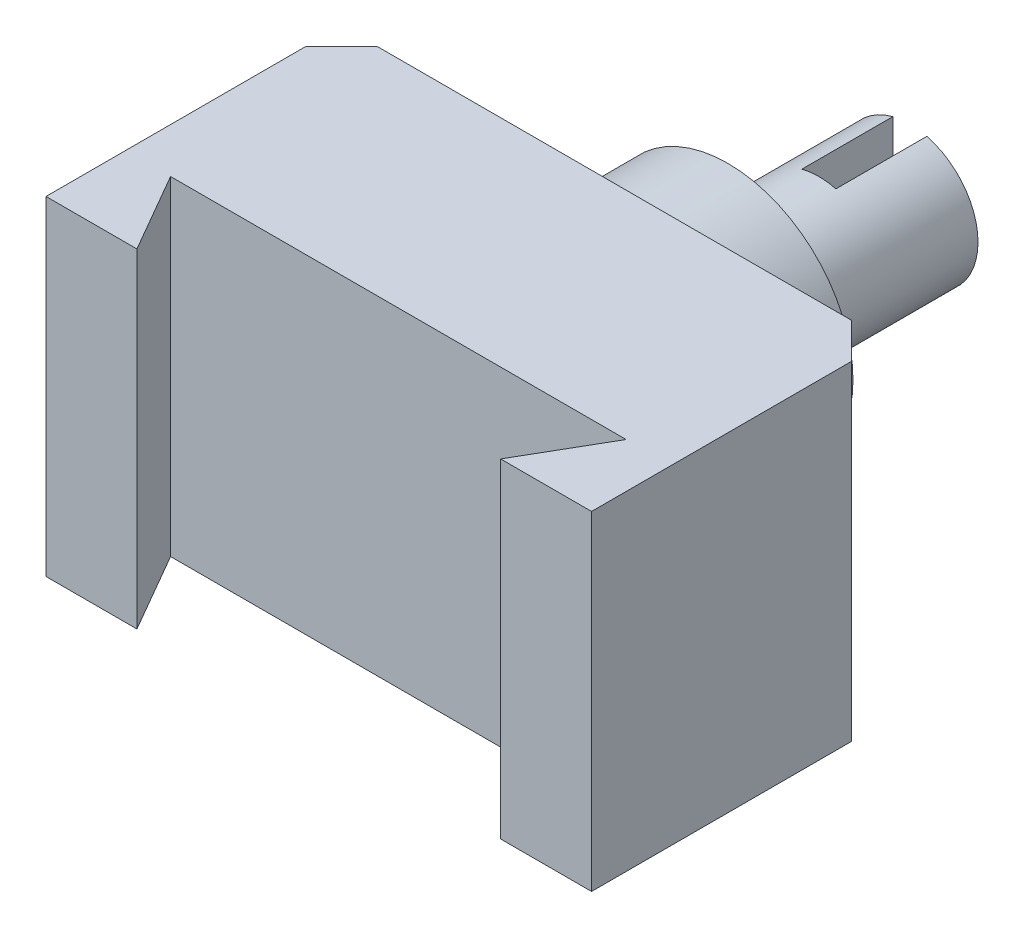
ISO-10303-21;
HEADER;
FILE_DESCRIPTION(('STEP AP214'),'2;1');
FILE_NAME('part.step','',(''),(''),'','','');
FILE_SCHEMA(('AUTOMOTIVE_DESIGN { 1 0 10303 214 1 1 1 1 }'));
ENDSEC;
DATA;
#1=APPLICATION_CONTEXT('core data for automotive mechanical design processes');
#2=APPLICATION_PROTOCOL_DEFINITION('international standard','automotive_design',2000,#1);
#3=PRODUCT_CONTEXT('',#1,'mechanical');
#4=PRODUCT('Part','Part','',(#3));
#5=PRODUCT_RELATED_PRODUCT_CATEGORY('part','',(#4));
#6=PRODUCT_DEFINITION_FORMATION('','',#4);
#7=PRODUCT_DEFINITION_CONTEXT('part definition',#1,'design');
#8=PRODUCT_DEFINITION('design','',#6,#7);
#9=PRODUCT_DEFINITION_SHAPE('','',#8);
#10=(LENGTH_UNIT() NAMED_UNIT(*) SI_UNIT(.MILLI.,.METRE.));
#11=(NAMED_UNIT(*) PLANE_ANGLE_UNIT() SI_UNIT($,.RADIAN.));
#12=(NAMED_UNIT(*) SI_UNIT($,.STERADIAN.) SOLID_ANGLE_UNIT());
#13=UNCERTAINTY_MEASURE_WITH_UNIT(LENGTH_MEASURE(1.E-05),#10,'distance_accuracy_value','');
#14=(GEOMETRIC_REPRESENTATION_CONTEXT(3) GLOBAL_UNCERTAINTY_ASSIGNED_CONTEXT((#13)) GLOBAL_UNIT_ASSIGNED_CONTEXT((#10,
#11,#12)) REPRESENTATION_CONTEXT('',''));
#15=CARTESIAN_POINT('',(0.,0.,0.));
#16=DIRECTION('',(0.,0.,1.));
#17=DIRECTION('',(1.,0.,0.));
#18=AXIS2_PLACEMENT_3D('',#15,#16,#17);
#19=CARTESIAN_POINT('',(0.,0.,-123.825));
#20=DIRECTION('',(0.,0.,-1.));
#21=DIRECTION('',(-1.,0.,0.));
#22=AXIS2_PLACEMENT_3D('',#19,#20,#21);
#23=PLANE('',#22);
#24=DIRECTION('',(0.,1.,0.));
#25=VECTOR('',#24,1.);
#26=CARTESIAN_POINT('',(-4.76250000000001,18.4450831863128,-123.825));
#27=LINE('',#26,#25);
#28=CARTESIAN_POINT('',(-4.7625,-18.4450831863128,-123.825));
#29=VERTEX_POINT('',#28);
#30=CARTESIAN_POINT('',(-4.76250000000001,18.4450831863128,-123.825));
#31=VERTEX_POINT('',#30);
#32=EDGE_CURVE('E171',#29,#31,#27,.T.);
#33=ORIENTED_EDGE('',*,*,#32,.F.);
#34=CARTESIAN_POINT('',(0.,0.,-123.825));
#35=DIRECTION('',(0.,0.,-1.));
#36=DIRECTION('',(-1.,0.,0.));
#37=AXIS2_PLACEMENT_3D('',#34,#35,#36);
#38=CIRCLE('',#37,19.05);
#39=EDGE_CURVE('E187',#29,#31,#38,.T.);
#40=ORIENTED_EDGE('',*,*,#39,.T.);
#41=EDGE_LOOP('',(#33,#40));
#42=FACE_BOUND('',#41,.T.);
#43=ADVANCED_FACE('F45',(#42),#23,.T.);
#44=CARTESIAN_POINT('',(76.2,45.974,41.275));
#45=DIRECTION('',(-1.,0.,0.));
#46=DIRECTION('',(0.,0.,1.));
#47=AXIS2_PLACEMENT_3D('',#44,#45,#46);
#48=PLANE('',#47);
#49=DIRECTION('',(0.,0.,-1.));
#50=VECTOR('',#49,1.);
#51=CARTESIAN_POINT('',(76.2,-45.974,41.275));
#52=LINE('',#51,#50);
#53=CARTESIAN_POINT('',(76.2,-45.974,41.275));
#54=VERTEX_POINT('',#53);
#55=CARTESIAN_POINT('',(76.2,-45.974,-31.2749999999999));
#56=VERTEX_POINT('',#55);
#57=EDGE_CURVE('E202',#54,#56,#52,.T.);
#58=ORIENTED_EDGE('',*,*,#57,.T.);
#59=DIRECTION('',(0.,1.,0.));
#60=VECTOR('',#59,1.);
#61=CARTESIAN_POINT('',(76.2,45.974,-31.2749999999999));
#62=LINE('',#61,#60);
#63=CARTESIAN_POINT('',(76.2,45.974,-31.2749999999999));
#64=VERTEX_POINT('',#63);
#65=EDGE_CURVE('E11',#56,#64,#62,.T.);
#66=ORIENTED_EDGE('',*,*,#65,.T.);
#67=DIRECTION('',(0.,0.,-1.));
#68=VECTOR('',#67,1.);
#69=CARTESIAN_POINT('',(76.2,45.974,41.275));
#70=LINE('',#69,#68);
#71=CARTESIAN_POINT('',(76.2,45.974,41.275));
#72=VERTEX_POINT('',#71);
#73=EDGE_CURVE('E207',#72,#64,#70,.T.);
#74=ORIENTED_EDGE('',*,*,#73,.F.);
#75=DIRECTION('',(0.,-1.,0.));
#76=VECTOR('',#75,1.);
#77=CARTESIAN_POINT('',(76.2,45.974,41.275));
#78=LINE('',#77,#76);
#79=EDGE_CURVE('E232',#72,#54,#78,.T.);
#80=ORIENTED_EDGE('',*,*,#79,.T.);
#81=EDGE_LOOP('',(#58,#66,#74,#80));
#82=FACE_BOUND('',#81,.T.);
#83=ADVANCED_FACE('F317',(#82),#48,.F.);
#84=CARTESIAN_POINT('',(-76.2,45.974,-41.275));
#85=DIRECTION('',(0.,0.,1.));
#86=DIRECTION('',(1.,0.,0.));
#87=AXIS2_PLACEMENT_3D('',#84,#85,#86);
#88=PLANE('',#87);
#89=CARTESIAN_POINT('',(0.,0.,-41.275));
#90=DIRECTION('',(0.,0.,-1.));
#91=DIRECTION('',(-1.,0.,0.));
#92=AXIS2_PLACEMENT_3D('',#89,#90,#91);
#93=CIRCLE('',#92,34.925);
#94=CARTESIAN_POINT('',(-34.925,0.,-41.275));
#95=VERTEX_POINT('',#94);
#96=EDGE_CURVE('E197',#95,#95,#93,.T.);
#97=ORIENTED_EDGE('',*,*,#96,.F.);
#98=EDGE_LOOP('',(#97));
#99=FACE_BOUND('',#98,.T.);
#100=DIRECTION('',(-1.,0.,0.));
#101=VECTOR('',#100,1.);
#102=CARTESIAN_POINT('',(-76.2,-45.974,-41.275));
#103=LINE('',#102,#101);
#104=CARTESIAN_POINT('',(66.1999999999999,-45.974,-41.275));
#105=VERTEX_POINT('',#104);
#106=CARTESIAN_POINT('',(-66.2,-45.974,-41.275));
#107=VERTEX_POINT('',#106);
#108=EDGE_CURVE('E235',#105,#107,#103,.T.);
#109=ORIENTED_EDGE('',*,*,#108,.T.);
#110=DIRECTION('',(0.,1.,0.));
#111=VECTOR('',#110,1.);
#112=CARTESIAN_POINT('',(-66.2,45.974,-41.275));
#113=LINE('',#112,#111);
#114=CARTESIAN_POINT('',(-66.2,45.974,-41.275));
#115=VERTEX_POINT('',#114);
#116=EDGE_CURVE('E68',#107,#115,#113,.T.);
#117=ORIENTED_EDGE('',*,*,#116,.T.);
#118=DIRECTION('',(-1.,0.,0.));
#119=VECTOR('',#118,1.);
#120=CARTESIAN_POINT('',(-76.2,45.974,-41.275));
#121=LINE('',#120,#119);
#122=CARTESIAN_POINT('',(66.1999999999999,45.974,-41.275));
#123=VERTEX_POINT('',#122);
#124=EDGE_CURVE('E210',#123,#115,#121,.T.);
#125=ORIENTED_EDGE('',*,*,#124,.F.);
#126=DIRECTION('',(0.,-1.,0.));
#127=VECTOR('',#126,1.);
#128=CARTESIAN_POINT('',(66.2,45.974,-41.275));
#129=LINE('',#128,#127);
#130=EDGE_CURVE('E286',#123,#105,#129,.T.);
#131=ORIENTED_EDGE('',*,*,#130,.T.);
#132=EDGE_LOOP('',(#109,#117,#125,#131));
#133=FACE_BOUND('',#132,.T.);
#134=ADVANCED_FACE('F311',(#99,#133),#88,.F.);
#135=CARTESIAN_POINT('',(-76.2,45.974,41.275));
#136=DIRECTION('',(1.,0.,0.));
#137=DIRECTION('',(0.,0.,-1.));
#138=AXIS2_PLACEMENT_3D('',#135,#136,#137);
#139=PLANE('',#138);
#140=DIRECTION('',(0.,0.,1.));
#141=VECTOR('',#140,1.);
#142=CARTESIAN_POINT('',(-76.2,45.974,41.275));
#143=LINE('',#142,#141);
#144=CARTESIAN_POINT('',(-76.2,45.974,-31.275));
#145=VERTEX_POINT('',#144);
#146=CARTESIAN_POINT('',(-76.2,45.974,41.275));
#147=VERTEX_POINT('',#146);
#148=EDGE_CURVE('E214',#145,#147,#143,.T.);
#149=ORIENTED_EDGE('',*,*,#148,.F.);
#150=DIRECTION('',(0.,-1.,0.));
#151=VECTOR('',#150,1.);
#152=CARTESIAN_POINT('',(-76.2,45.974,-31.275));
#153=LINE('',#152,#151);
#154=CARTESIAN_POINT('',(-76.2,-45.974,-31.275));
#155=VERTEX_POINT('',#154);
#156=EDGE_CURVE('E196',#145,#155,#153,.T.);
#157=ORIENTED_EDGE('',*,*,#156,.T.);
#158=DIRECTION('',(0.,0.,1.));
#159=VECTOR('',#158,1.);
#160=CARTESIAN_POINT('',(-76.2,-45.974,41.275));
#161=LINE('',#160,#159);
#162=CARTESIAN_POINT('',(-76.2,-45.974,41.275));
#163=VERTEX_POINT('',#162);
#164=EDGE_CURVE('E238',#155,#163,#161,.T.);
#165=ORIENTED_EDGE('',*,*,#164,.T.);
#166=DIRECTION('',(0.,-1.,0.));
#167=VECTOR('',#166,1.);
#168=CARTESIAN_POINT('',(-76.2,45.974,41.275));
#169=LINE('',#168,#167);
#170=EDGE_CURVE('E206',#147,#163,#169,.T.);
#171=ORIENTED_EDGE('',*,*,#170,.F.);
#172=EDGE_LOOP('',(#149,#157,#165,#171));
#173=FACE_BOUND('',#172,.T.);
#174=ADVANCED_FACE('F303',(#173),#139,.F.);
#175=CARTESIAN_POINT('',(-76.2,45.974,41.275));
#176=DIRECTION('',(0.,0.,-1.));
#177=DIRECTION('',(-1.,0.,0.));
#178=AXIS2_PLACEMENT_3D('',#175,#176,#177);
#179=PLANE('',#178);
#180=DIRECTION('',(1.,0.,0.));
#181=VECTOR('',#180,1.);
#182=CARTESIAN_POINT('',(-76.2,-45.974,41.275));
#183=LINE('',#182,#181);
#184=CARTESIAN_POINT('',(-50.8,-45.974,41.275));
#185=VERTEX_POINT('',#184);
#186=EDGE_CURVE('E241',#163,#185,#183,.T.);
#187=ORIENTED_EDGE('',*,*,#186,.T.);
#188=DIRECTION('',(0.,-1.,0.));
#189=VECTOR('',#188,1.);
#190=CARTESIAN_POINT('',(-50.8,45.974,41.275));
#191=LINE('',#190,#189);
#192=CARTESIAN_POINT('',(-50.8,45.974,41.275));
#193=VERTEX_POINT('',#192);
#194=EDGE_CURVE('E270',#193,#185,#191,.T.);
#195=ORIENTED_EDGE('',*,*,#194,.F.);
#196=DIRECTION('',(1.,0.,0.));
#197=VECTOR('',#196,1.);
#198=CARTESIAN_POINT('',(-76.2,45.974,41.275));
#199=LINE('',#198,#197);
#200=EDGE_CURVE('E217',#147,#193,#199,.T.);
#201=ORIENTED_EDGE('',*,*,#200,.F.);
#202=ORIENTED_EDGE('',*,*,#170,.T.);
#203=EDGE_LOOP('',(#187,#195,#201,#202));
#204=FACE_BOUND('',#203,.T.);
#205=ADVANCED_FACE('F339',(#204),#179,.F.);
#206=CARTESIAN_POINT('',(-50.8,45.974,41.275));
#207=DIRECTION('',(-0.866025403784437,0.,0.500000000000003));
#208=DIRECTION('',(0.500000000000004,0.,0.866025403784437));
#209=AXIS2_PLACEMENT_3D('',#206,#207,#208);
#210=PLANE('',#209);
#211=DIRECTION('',(-0.500000000000003,0.,-0.866025403784437));
#212=VECTOR('',#211,1.);
#213=CARTESIAN_POINT('',(-50.8,-45.974,41.275));
#214=LINE('',#213,#212);
#215=CARTESIAN_POINT('',(-63.6316097327395,-45.974,19.05));
#216=VERTEX_POINT('',#215);
#217=EDGE_CURVE('E244',#185,#216,#214,.T.);
#218=ORIENTED_EDGE('',*,*,#217,.T.);
#219=DIRECTION('',(0.,-1.,0.));
#220=VECTOR('',#219,1.);
#221=CARTESIAN_POINT('',(-63.6316097327395,45.974,19.05));
#222=LINE('',#221,#220);
#223=CARTESIAN_POINT('',(-63.6316097327395,45.974,19.05));
#224=VERTEX_POINT('',#223);
#225=EDGE_CURVE('E266',#224,#216,#222,.T.);
#226=ORIENTED_EDGE('',*,*,#225,.F.);
#227=DIRECTION('',(-0.500000000000003,0.,-0.866025403784437));
#228=VECTOR('',#227,1.);
#229=CARTESIAN_POINT('',(-50.8,45.974,41.275));
#230=LINE('',#229,#228);
#231=EDGE_CURVE('E220',#193,#224,#230,.T.);
#232=ORIENTED_EDGE('',*,*,#231,.F.);
#233=ORIENTED_EDGE('',*,*,#194,.T.);
#234=EDGE_LOOP('',(#218,#226,#232,#233));
#235=FACE_BOUND('',#234,.T.);
#236=ADVANCED_FACE('F336',(#235),#210,.F.);
#237=CARTESIAN_POINT('',(-63.6316097327395,45.974,19.05));
#238=DIRECTION('',(0.,0.,-1.));
#239=DIRECTION('',(-1.,0.,0.));
#240=AXIS2_PLACEMENT_3D('',#237,#238,#239);
#241=PLANE('',#240);
#242=DIRECTION('',(1.,0.,0.));
#243=VECTOR('',#242,1.);
#244=CARTESIAN_POINT('',(-63.6316097327395,-45.974,19.05));
#245=LINE('',#244,#243);
#246=CARTESIAN_POINT('',(63.6316097327396,-45.974,19.05));
#247=VERTEX_POINT('',#246);
#248=EDGE_CURVE('E247',#216,#247,#245,.T.);
#249=ORIENTED_EDGE('',*,*,#248,.T.);
#250=DIRECTION('',(0.,-1.,0.));
#251=VECTOR('',#250,1.);
#252=CARTESIAN_POINT('',(63.6316097327396,45.974,19.05));
#253=LINE('',#252,#251);
#254=CARTESIAN_POINT('',(63.6316097327396,45.974,19.05));
#255=VERTEX_POINT('',#254);
#256=EDGE_CURVE('E262',#255,#247,#253,.T.);
#257=ORIENTED_EDGE('',*,*,#256,.F.);
#258=DIRECTION('',(1.,0.,0.));
#259=VECTOR('',#258,1.);
#260=CARTESIAN_POINT('',(-63.6316097327395,45.974,19.05));
#261=LINE('',#260,#259);
#262=EDGE_CURVE('E223',#224,#255,#261,.T.);
#263=ORIENTED_EDGE('',*,*,#262,.F.);
#264=ORIENTED_EDGE('',*,*,#225,.T.);
#265=EDGE_LOOP('',(#249,#257,#263,#264));
#266=FACE_BOUND('',#265,.T.);
#267=ADVANCED_FACE('F332',(#266),#241,.F.);
#268=CARTESIAN_POINT('',(63.6316097327396,45.974,19.05));
#269=DIRECTION('',(0.866025403784436,0.,0.500000000000004));
#270=DIRECTION('',(0.500000000000004,0.,-0.866025403784437));
#271=AXIS2_PLACEMENT_3D('',#268,#269,#270);
#272=PLANE('',#271);
#273=DIRECTION('',(-0.500000000000004,0.,0.866025403784436));
#274=VECTOR('',#273,1.);
#275=CARTESIAN_POINT('',(63.6316097327396,-45.974,19.05));
#276=LINE('',#275,#274);
#277=CARTESIAN_POINT('',(50.8,-45.974,41.275));
#278=VERTEX_POINT('',#277);
#279=EDGE_CURVE('E250',#247,#278,#276,.T.);
#280=ORIENTED_EDGE('',*,*,#279,.T.);
#281=DIRECTION('',(0.,-1.,0.));
#282=VECTOR('',#281,1.);
#283=CARTESIAN_POINT('',(50.8,45.974,41.275));
#284=LINE('',#283,#282);
#285=CARTESIAN_POINT('',(50.8,45.974,41.275));
#286=VERTEX_POINT('',#285);
#287=EDGE_CURVE('E258',#286,#278,#284,.T.);
#288=ORIENTED_EDGE('',*,*,#287,.F.);
#289=DIRECTION('',(-0.500000000000004,0.,0.866025403784436));
#290=VECTOR('',#289,1.);
#291=CARTESIAN_POINT('',(63.6316097327396,45.974,19.05));
#292=LINE('',#291,#290);
#293=EDGE_CURVE('E226',#255,#286,#292,.T.);
#294=ORIENTED_EDGE('',*,*,#293,.F.);
#295=ORIENTED_EDGE('',*,*,#256,.T.);
#296=EDGE_LOOP('',(#280,#288,#294,#295));
#297=FACE_BOUND('',#296,.T.);
#298=ADVANCED_FACE('F327',(#297),#272,.F.);
#299=CARTESIAN_POINT('',(50.8,45.974,41.275));
#300=DIRECTION('',(0.,0.,-1.));
#301=DIRECTION('',(-1.,0.,0.));
#302=AXIS2_PLACEMENT_3D('',#299,#300,#301);
#303=PLANE('',#302);
#304=DIRECTION('',(1.,0.,0.));
#305=VECTOR('',#304,1.);
#306=CARTESIAN_POINT('',(50.8,-45.974,41.275));
#307=LINE('',#306,#305);
#308=EDGE_CURVE('E211',#278,#54,#307,.T.);
#309=ORIENTED_EDGE('',*,*,#308,.T.);
#310=ORIENTED_EDGE('',*,*,#79,.F.);
#311=DIRECTION('',(1.,0.,0.));
#312=VECTOR('',#311,1.);
#313=CARTESIAN_POINT('',(50.8,45.974,41.275));
#314=LINE('',#313,#312);
#315=EDGE_CURVE('E229',#286,#72,#314,.T.);
#316=ORIENTED_EDGE('',*,*,#315,.F.);
#317=ORIENTED_EDGE('',*,*,#287,.T.);
#318=EDGE_LOOP('',(#309,#310,#316,#317));
#319=FACE_BOUND('',#318,.T.);
#320=ADVANCED_FACE('F321',(#319),#303,.F.);
#321=CARTESIAN_POINT('',(0.,45.974,0.));
#322=DIRECTION('',(0.,-1.,0.));
#323=DIRECTION('',(0.,0.,-1.));
#324=AXIS2_PLACEMENT_3D('',#321,#322,#323);
#325=PLANE('',#324);
#326=ORIENTED_EDGE('',*,*,#124,.T.);
#327=DIRECTION('',(0.70710678118655,0.,-0.707106781186546));
#328=VECTOR('',#327,1.);
#329=CARTESIAN_POINT('',(-76.2,45.974,-31.275));
#330=LINE('',#329,#328);
#331=EDGE_CURVE('E55',#115,#145,#330,.F.);
#332=ORIENTED_EDGE('',*,*,#331,.T.);
#333=ORIENTED_EDGE('',*,*,#148,.T.);
#334=ORIENTED_EDGE('',*,*,#200,.T.);
#335=ORIENTED_EDGE('',*,*,#231,.T.);
#336=ORIENTED_EDGE('',*,*,#262,.T.);
#337=ORIENTED_EDGE('',*,*,#293,.T.);
#338=ORIENTED_EDGE('',*,*,#315,.T.);
#339=ORIENTED_EDGE('',*,*,#73,.T.);
#340=DIRECTION('',(0.707106781186546,0.,0.707106781186549));
#341=VECTOR('',#340,1.);
#342=CARTESIAN_POINT('',(66.2,45.974,-41.275));
#343=LINE('',#342,#341);
#344=EDGE_CURVE('E292',#64,#123,#343,.F.);
#345=ORIENTED_EDGE('',*,*,#344,.T.);
#346=EDGE_LOOP('',(#326,#332,#333,#334,#335,#336,#337,#338,#339,#345));
#347=FACE_BOUND('',#346,.T.);
#348=ADVANCED_FACE('F298',(#347),#325,.F.);
#349=CARTESIAN_POINT('',(0.,-45.974,0.));
#350=DIRECTION('',(0.,-1.,0.));
#351=DIRECTION('',(0.,0.,-1.));
#352=AXIS2_PLACEMENT_3D('',#349,#350,#351);
#353=PLANE('',#352);
#354=ORIENTED_EDGE('',*,*,#164,.F.);
#355=DIRECTION('',(-0.70710678118655,0.,0.707106781186546));
#356=VECTOR('',#355,1.);
#357=CARTESIAN_POINT('',(-53.7374999999998,-45.974,-53.7375000000001));
#358=LINE('',#357,#356);
#359=EDGE_CURVE('E283',#155,#107,#358,.F.);
#360=ORIENTED_EDGE('',*,*,#359,.T.);
#361=ORIENTED_EDGE('',*,*,#108,.F.);
#362=DIRECTION('',(-0.707106781186546,0.,-0.707106781186549));
#363=VECTOR('',#362,1.);
#364=CARTESIAN_POINT('',(53.7375000000002,-45.974,-53.7374999999999));
#365=LINE('',#364,#363);
#366=EDGE_CURVE('E280',#105,#56,#365,.F.);
#367=ORIENTED_EDGE('',*,*,#366,.T.);
#368=ORIENTED_EDGE('',*,*,#57,.F.);
#369=ORIENTED_EDGE('',*,*,#308,.F.);
#370=ORIENTED_EDGE('',*,*,#279,.F.);
#371=ORIENTED_EDGE('',*,*,#248,.F.);
#372=ORIENTED_EDGE('',*,*,#217,.F.);
#373=ORIENTED_EDGE('',*,*,#186,.F.);
#374=EDGE_LOOP('',(#354,#360,#361,#367,#368,#369,#370,#371,#372,#373));
#375=FACE_BOUND('',#374,.T.);
#376=ADVANCED_FACE('F309',(#375),#353,.T.);
#377=CARTESIAN_POINT('',(0.,0.,-73.025));
#378=DIRECTION('',(0.,0.,1.));
#379=DIRECTION('',(1.,0.,0.));
#380=AXIS2_PLACEMENT_3D('',#377,#378,#379);
#381=CYLINDRICAL_SURFACE('',#380,34.925);
#382=CARTESIAN_POINT('',(0.,0.,-73.025));
#383=DIRECTION('',(0.,0.,-1.));
#384=DIRECTION('',(-1.,0.,0.));
#385=AXIS2_PLACEMENT_3D('',#382,#383,#384);
#386=CIRCLE('',#385,34.925);
#387=CARTESIAN_POINT('',(-34.925,0.,-73.025));
#388=VERTEX_POINT('',#387);
#389=EDGE_CURVE('E198',#388,#388,#386,.T.);
#390=ORIENTED_EDGE('',*,*,#389,.F.);
#391=EDGE_LOOP('',(#390));
#392=FACE_BOUND('',#391,.T.);
#393=ORIENTED_EDGE('',*,*,#96,.T.);
#394=EDGE_LOOP('',(#393));
#395=FACE_BOUND('',#394,.T.);
#396=ADVANCED_FACE('F385',(#392,#395),#381,.T.);
#397=CARTESIAN_POINT('',(0.,0.,-73.025));
#398=DIRECTION('',(0.,0.,-1.));
#399=DIRECTION('',(-1.,0.,0.));
#400=AXIS2_PLACEMENT_3D('',#397,#398,#399);
#401=PLANE('',#400);
#402=CARTESIAN_POINT('',(0.,0.,-73.025));
#403=DIRECTION('',(0.,0.,-1.));
#404=DIRECTION('',(-1.,0.,0.));
#405=AXIS2_PLACEMENT_3D('',#402,#403,#404);
#406=CIRCLE('',#405,19.05);
#407=CARTESIAN_POINT('',(-19.05,0.,-73.025));
#408=VERTEX_POINT('',#407);
#409=EDGE_CURVE('E192',#408,#408,#406,.T.);
#410=ORIENTED_EDGE('',*,*,#409,.F.);
#411=EDGE_LOOP('',(#410));
#412=FACE_BOUND('',#411,.T.);
#413=ORIENTED_EDGE('',*,*,#389,.T.);
#414=EDGE_LOOP('',(#413));
#415=FACE_BOUND('',#414,.T.);
#416=ADVANCED_FACE('F368',(#412,#415),#401,.T.);
#417=CARTESIAN_POINT('',(0.,0.,-123.825));
#418=DIRECTION('',(0.,0.,1.));
#419=DIRECTION('',(1.,0.,0.));
#420=AXIS2_PLACEMENT_3D('',#417,#418,#419);
#421=CYLINDRICAL_SURFACE('',#420,19.05);
#422=CARTESIAN_POINT('',(0.,0.,-98.425));
#423=DIRECTION('',(0.,0.,-1.));
#424=DIRECTION('',(-1.,0.,0.));
#425=AXIS2_PLACEMENT_3D('',#422,#423,#424);
#426=CIRCLE('',#425,19.05);
#427=CARTESIAN_POINT('',(-4.76250000000001,18.4450831863128,-98.425));
#428=VERTEX_POINT('',#427);
#429=CARTESIAN_POINT('',(4.76250000000001,18.4450831863128,-98.425));
#430=VERTEX_POINT('',#429);
#431=EDGE_CURVE('E161',#428,#430,#426,.T.);
#432=ORIENTED_EDGE('',*,*,#431,.F.);
#433=DIRECTION('',(0.,0.,-1.));
#434=VECTOR('',#433,1.);
#435=CARTESIAN_POINT('',(-4.76250000000001,18.4450831863128,-98.425));
#436=LINE('',#435,#434);
#437=EDGE_CURVE('E191',#428,#31,#436,.T.);
#438=ORIENTED_EDGE('',*,*,#437,.T.);
#439=ORIENTED_EDGE('',*,*,#39,.F.);
#440=DIRECTION('',(0.,0.,-1.));
#441=VECTOR('',#440,1.);
#442=CARTESIAN_POINT('',(-4.7625,-18.4450831863128,-98.425));
#443=LINE('',#442,#441);
#444=CARTESIAN_POINT('',(-4.7625,-18.4450831863128,-98.425));
#445=VERTEX_POINT('',#444);
#446=EDGE_CURVE('E182',#445,#29,#443,.T.);
#447=ORIENTED_EDGE('',*,*,#446,.F.);
#448=CARTESIAN_POINT('',(0.,0.,-98.425));
#449=DIRECTION('',(0.,0.,-1.));
#450=DIRECTION('',(-1.,0.,0.));
#451=AXIS2_PLACEMENT_3D('',#448,#449,#450);
#452=CIRCLE('',#451,19.05);
#453=CARTESIAN_POINT('',(4.76250000000001,-18.4450831863128,-98.425));
#454=VERTEX_POINT('',#453);
#455=EDGE_CURVE('E160',#454,#445,#452,.T.);
#456=ORIENTED_EDGE('',*,*,#455,.F.);
#457=DIRECTION('',(0.,0.,-1.));
#458=VECTOR('',#457,1.);
#459=CARTESIAN_POINT('',(4.76250000000001,-18.4450831863128,-98.425));
#460=LINE('',#459,#458);
#461=CARTESIAN_POINT('',(4.76250000000001,-18.4450831863128,-123.825));
#462=VERTEX_POINT('',#461);
#463=EDGE_CURVE('E156',#454,#462,#460,.T.);
#464=ORIENTED_EDGE('',*,*,#463,.T.);
#465=CARTESIAN_POINT('',(4.76250000000001,18.4450831863128,-123.825));
#466=VERTEX_POINT('',#465);
#467=EDGE_CURVE('E177',#466,#462,#38,.T.);
#468=ORIENTED_EDGE('',*,*,#467,.F.);
#469=DIRECTION('',(0.,0.,-1.));
#470=VECTOR('',#469,1.);
#471=CARTESIAN_POINT('',(4.76250000000001,18.4450831863128,-98.425));
#472=LINE('',#471,#470);
#473=EDGE_CURVE('E153',#430,#466,#472,.T.);
#474=ORIENTED_EDGE('',*,*,#473,.F.);
#475=EDGE_LOOP('',(#432,#438,#439,#447,#456,#464,#468,#474));
#476=FACE_BOUND('',#475,.T.);
#477=ORIENTED_EDGE('',*,*,#409,.T.);
#478=EDGE_LOOP('',(#477));
#479=FACE_BOUND('',#478,.T.);
#480=ADVANCED_FACE('F174',(#476,#479),#421,.T.);
#481=DIRECTION('',(0.,-1.,0.));
#482=VECTOR('',#481,1.);
#483=CARTESIAN_POINT('',(4.76250000000001,18.4450831863128,-123.825));
#484=LINE('',#483,#482);
#485=EDGE_CURVE('E369',#466,#462,#484,.T.);
#486=ORIENTED_EDGE('',*,*,#485,.F.);
#487=ORIENTED_EDGE('',*,*,#467,.T.);
#488=EDGE_LOOP('',(#486,#487));
#489=FACE_BOUND('',#488,.T.);
#490=ADVANCED_FACE('F351',(#489),#23,.T.);
#491=CARTESIAN_POINT('',(-4.76250000000001,18.4450831863128,-98.425));
#492=DIRECTION('',(-1.,0.,0.));
#493=DIRECTION('',(0.,0.,1.));
#494=AXIS2_PLACEMENT_3D('',#491,#492,#493);
#495=PLANE('',#494);
#496=ORIENTED_EDGE('',*,*,#32,.T.);
#497=ORIENTED_EDGE('',*,*,#437,.F.);
#498=DIRECTION('',(0.,1.,0.));
#499=VECTOR('',#498,1.);
#500=CARTESIAN_POINT('',(-4.76250000000001,18.4450831863128,-98.425));
#501=LINE('',#500,#499);
#502=EDGE_CURVE('E167',#445,#428,#501,.T.);
#503=ORIENTED_EDGE('',*,*,#502,.F.);
#504=ORIENTED_EDGE('',*,*,#446,.T.);
#505=EDGE_LOOP('',(#496,#497,#503,#504));
#506=FACE_BOUND('',#505,.T.);
#507=ADVANCED_FACE('F360',(#506),#495,.F.);
#508=CARTESIAN_POINT('',(4.76250000000001,18.4450831863128,-98.425));
#509=DIRECTION('',(1.,0.,0.));
#510=DIRECTION('',(0.,0.,-1.));
#511=AXIS2_PLACEMENT_3D('',#508,#509,#510);
#512=PLANE('',#511);
#513=ORIENTED_EDGE('',*,*,#485,.T.);
#514=ORIENTED_EDGE('',*,*,#463,.F.);
#515=DIRECTION('',(0.,-1.,0.));
#516=VECTOR('',#515,1.);
#517=CARTESIAN_POINT('',(4.76250000000001,18.4450831863128,-98.425));
#518=LINE('',#517,#516);
#519=EDGE_CURVE('E149',#430,#454,#518,.T.);
#520=ORIENTED_EDGE('',*,*,#519,.F.);
#521=ORIENTED_EDGE('',*,*,#473,.T.);
#522=EDGE_LOOP('',(#513,#514,#520,#521));
#523=FACE_BOUND('',#522,.T.);
#524=ADVANCED_FACE('F151',(#523),#512,.F.);
#525=CARTESIAN_POINT('',(0.,0.,-98.425));
#526=DIRECTION('',(0.,0.,-1.));
#527=DIRECTION('',(-1.,0.,0.));
#528=AXIS2_PLACEMENT_3D('',#525,#526,#527);
#529=PLANE('',#528);
#530=ORIENTED_EDGE('',*,*,#431,.T.);
#531=ORIENTED_EDGE('',*,*,#519,.T.);
#532=ORIENTED_EDGE('',*,*,#455,.T.);
#533=ORIENTED_EDGE('',*,*,#502,.T.);
#534=EDGE_LOOP('',(#530,#531,#532,#533));
#535=FACE_BOUND('',#534,.T.);
#536=ADVANCED_FACE('F165',(#535),#529,.T.);
#537=CARTESIAN_POINT('',(-76.2,45.974,-31.275));
#538=DIRECTION('',(0.707106781186545,0.,0.707106781186549));
#539=DIRECTION('',(0.,-1.,0.));
#540=AXIS2_PLACEMENT_3D('',#537,#538,#539);
#541=PLANE('',#540);
#542=ORIENTED_EDGE('',*,*,#331,.F.);
#543=ORIENTED_EDGE('',*,*,#116,.F.);
#544=ORIENTED_EDGE('',*,*,#359,.F.);
#545=ORIENTED_EDGE('',*,*,#156,.F.);
#546=EDGE_LOOP('',(#542,#543,#544,#545));
#547=FACE_BOUND('',#546,.T.);
#548=ADVANCED_FACE('F306',(#547),#541,.F.);
#549=CARTESIAN_POINT('',(66.2,45.974,-41.275));
#550=DIRECTION('',(-0.707106781186549,0.,0.707106781186545));
#551=DIRECTION('',(0.,-1.,0.));
#552=AXIS2_PLACEMENT_3D('',#549,#550,#551);
#553=PLANE('',#552);
#554=ORIENTED_EDGE('',*,*,#344,.F.);
#555=ORIENTED_EDGE('',*,*,#65,.F.);
#556=ORIENTED_EDGE('',*,*,#366,.F.);
#557=ORIENTED_EDGE('',*,*,#130,.F.);
#558=EDGE_LOOP('',(#554,#555,#556,#557));
#559=FACE_BOUND('',#558,.T.);
#560=ADVANCED_FACE('F48',(#559),#553,.F.);
#561=CLOSED_SHELL('',(#43,#83,#134,#174,#205,#236,#267,#298,#320,#348,#376,#396,#416,#480,#490,
#507,#524,#536,#548,#560));
#562=MANIFOLD_SOLID_BREP('B2',#561);
#563=ADVANCED_BREP_SHAPE_REPRESENTATION('',(#18,#562),#14);
#564=SHAPE_DEFINITION_REPRESENTATION(#9,#563);
ENDSEC;
END-ISO-10303-21;
